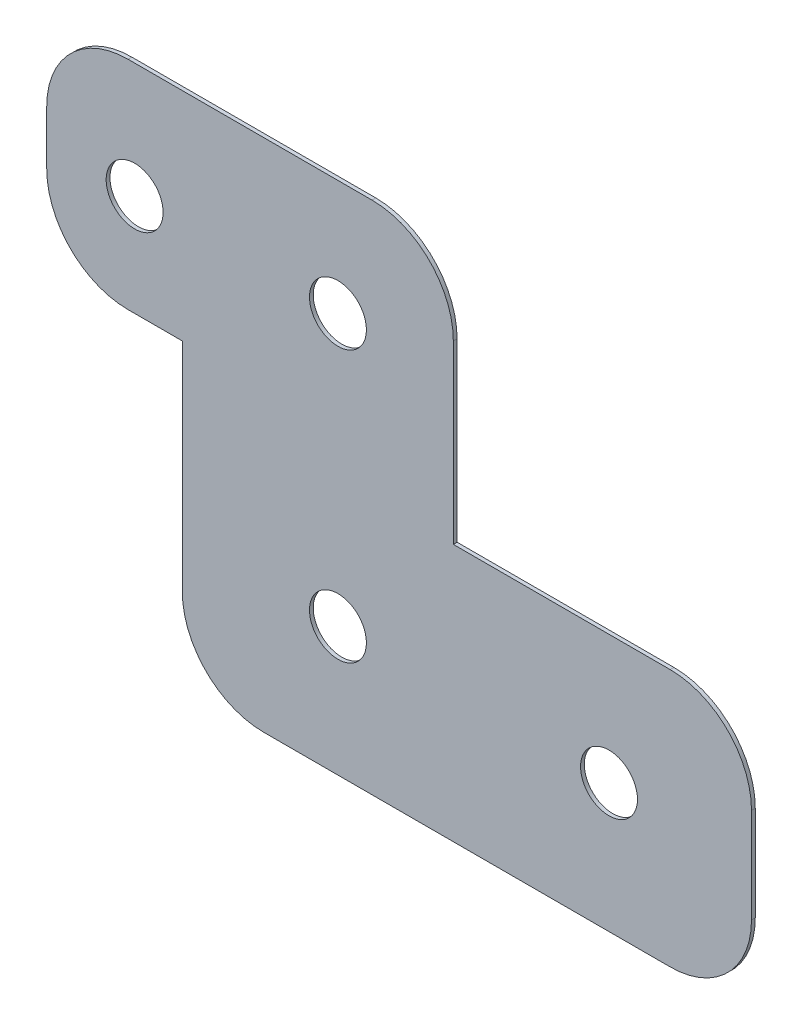
ISO-10303-21;
HEADER;
FILE_DESCRIPTION(('STEP AP214'),'2;1');
FILE_NAME('part.step','',(''),(''),'','','');
FILE_SCHEMA(('AUTOMOTIVE_DESIGN { 1 0 10303 214 1 1 1 1 }'));
ENDSEC;
DATA;
#1=APPLICATION_CONTEXT('core data for automotive mechanical design processes');
#2=APPLICATION_PROTOCOL_DEFINITION('international standard','automotive_design',2000,#1);
#3=PRODUCT_CONTEXT('',#1,'mechanical');
#4=PRODUCT('Part','Part','',(#3));
#5=PRODUCT_RELATED_PRODUCT_CATEGORY('part','',(#4));
#6=PRODUCT_DEFINITION_FORMATION('','',#4);
#7=PRODUCT_DEFINITION_CONTEXT('part definition',#1,'design');
#8=PRODUCT_DEFINITION('design','',#6,#7);
#9=PRODUCT_DEFINITION_SHAPE('','',#8);
#10=(LENGTH_UNIT() NAMED_UNIT(*) SI_UNIT(.MILLI.,.METRE.));
#11=(NAMED_UNIT(*) PLANE_ANGLE_UNIT() SI_UNIT($,.RADIAN.));
#12=(NAMED_UNIT(*) SI_UNIT($,.STERADIAN.) SOLID_ANGLE_UNIT());
#13=UNCERTAINTY_MEASURE_WITH_UNIT(LENGTH_MEASURE(1.E-05),#10,'distance_accuracy_value','');
#14=(GEOMETRIC_REPRESENTATION_CONTEXT(3) GLOBAL_UNCERTAINTY_ASSIGNED_CONTEXT((#13)) GLOBAL_UNIT_ASSIGNED_CONTEXT((#10,
#11,#12)) REPRESENTATION_CONTEXT('',''));
#15=CARTESIAN_POINT('',(0.,0.,0.));
#16=DIRECTION('',(0.,0.,1.));
#17=DIRECTION('',(1.,0.,0.));
#18=AXIS2_PLACEMENT_3D('',#15,#16,#17);
#19=CARTESIAN_POINT('',(-460.,380.,2.778125));
#20=DIRECTION('',(1.,0.,0.));
#21=DIRECTION('',(0.,0.,-1.));
#22=AXIS2_PLACEMENT_3D('',#19,#20,#21);
#23=PLANE('',#22);
#24=DIRECTION('',(0.,-1.,0.));
#25=VECTOR('',#24,1.);
#26=CARTESIAN_POINT('',(-460.,380.,0.));
#27=LINE('',#26,#25);
#28=CARTESIAN_POINT('',(-460.,320.,0.));
#29=VERTEX_POINT('',#28);
#30=CARTESIAN_POINT('',(-460.,280.,0.));
#31=VERTEX_POINT('',#30);
#32=EDGE_CURVE('E174',#29,#31,#27,.T.);
#33=ORIENTED_EDGE('',*,*,#32,.T.);
#34=DIRECTION('',(0.,0.,1.));
#35=VECTOR('',#34,1.);
#36=CARTESIAN_POINT('',(-460.,280.,2.778125));
#37=LINE('',#36,#35);
#38=CARTESIAN_POINT('',(-460.,280.,2.778125));
#39=VERTEX_POINT('',#38);
#40=EDGE_CURVE('E197',#31,#39,#37,.T.);
#41=ORIENTED_EDGE('',*,*,#40,.T.);
#42=DIRECTION('',(0.,-1.,0.));
#43=VECTOR('',#42,1.);
#44=CARTESIAN_POINT('',(-460.,380.,2.778125));
#45=LINE('',#44,#43);
#46=CARTESIAN_POINT('',(-460.,320.,2.778125));
#47=VERTEX_POINT('',#46);
#48=EDGE_CURVE('E175',#47,#39,#45,.T.);
#49=ORIENTED_EDGE('',*,*,#48,.F.);
#50=DIRECTION('',(0.,0.,-1.));
#51=VECTOR('',#50,1.);
#52=CARTESIAN_POINT('',(-460.,320.,2.778125));
#53=LINE('',#52,#51);
#54=EDGE_CURVE('E186',#47,#29,#53,.T.);
#55=ORIENTED_EDGE('',*,*,#54,.T.);
#56=EDGE_LOOP('',(#33,#41,#49,#55));
#57=FACE_BOUND('',#56,.T.);
#58=ADVANCED_FACE('F33',(#57),#23,.F.);
#59=CARTESIAN_POINT('',(-460.,0.,2.778125));
#60=DIRECTION('',(0.,1.,0.));
#61=DIRECTION('',(0.,0.,1.));
#62=AXIS2_PLACEMENT_3D('',#59,#60,#61);
#63=PLANE('',#62);
#64=DIRECTION('',(1.,0.,0.));
#65=VECTOR('',#64,1.);
#66=CARTESIAN_POINT('',(-460.,0.,0.));
#67=LINE('',#66,#65);
#68=CARTESIAN_POINT('',(-300.,0.,0.));
#69=VERTEX_POINT('',#68);
#70=CARTESIAN_POINT('',(0.,0.,0.));
#71=VERTEX_POINT('',#70);
#72=EDGE_CURVE('E189',#69,#71,#67,.T.);
#73=ORIENTED_EDGE('',*,*,#72,.T.);
#74=DIRECTION('',(0.,0.,-1.));
#75=VECTOR('',#74,1.);
#76=CARTESIAN_POINT('',(0.,0.,2.778125));
#77=LINE('',#76,#75);
#78=CARTESIAN_POINT('',(0.,0.,2.778125));
#79=VERTEX_POINT('',#78);
#80=EDGE_CURVE('E41',#71,#79,#77,.F.);
#81=ORIENTED_EDGE('',*,*,#80,.T.);
#82=DIRECTION('',(1.,0.,0.));
#83=VECTOR('',#82,1.);
#84=CARTESIAN_POINT('',(-460.,0.,2.778125));
#85=LINE('',#84,#83);
#86=CARTESIAN_POINT('',(-300.,0.,2.778125));
#87=VERTEX_POINT('',#86);
#88=EDGE_CURVE('E177',#87,#79,#85,.T.);
#89=ORIENTED_EDGE('',*,*,#88,.F.);
#90=DIRECTION('',(0.,0.,1.));
#91=VECTOR('',#90,1.);
#92=CARTESIAN_POINT('',(-300.,0.,2.778125));
#93=LINE('',#92,#91);
#94=EDGE_CURVE('E240',#87,#69,#93,.F.);
#95=ORIENTED_EDGE('',*,*,#94,.T.);
#96=EDGE_LOOP('',(#73,#81,#89,#95));
#97=FACE_BOUND('',#96,.T.);
#98=ADVANCED_FACE('F244',(#97),#63,.F.);
#99=CARTESIAN_POINT('',(60.,380.,2.778125));
#100=DIRECTION('',(-1.,0.,0.));
#101=DIRECTION('',(0.,0.,1.));
#102=AXIS2_PLACEMENT_3D('',#99,#100,#101);
#103=PLANE('',#102);
#104=DIRECTION('',(0.,1.,0.));
#105=VECTOR('',#104,1.);
#106=CARTESIAN_POINT('',(60.,380.,0.));
#107=LINE('',#106,#105);
#108=CARTESIAN_POINT('',(60.,60.,0.));
#109=VERTEX_POINT('',#108);
#110=CARTESIAN_POINT('',(60.,130.,0.));
#111=VERTEX_POINT('',#110);
#112=EDGE_CURVE('E191',#109,#111,#107,.T.);
#113=ORIENTED_EDGE('',*,*,#112,.T.);
#114=DIRECTION('',(0.,0.,1.));
#115=VECTOR('',#114,1.);
#116=CARTESIAN_POINT('',(60.,130.,2.778125));
#117=LINE('',#116,#115);
#118=CARTESIAN_POINT('',(60.,130.,2.778125));
#119=VERTEX_POINT('',#118);
#120=EDGE_CURVE('E235',#111,#119,#117,.T.);
#121=ORIENTED_EDGE('',*,*,#120,.T.);
#122=DIRECTION('',(0.,1.,0.));
#123=VECTOR('',#122,1.);
#124=CARTESIAN_POINT('',(60.,380.,2.778125));
#125=LINE('',#124,#123);
#126=CARTESIAN_POINT('',(60.,60.,2.778125));
#127=VERTEX_POINT('',#126);
#128=EDGE_CURVE('E181',#127,#119,#125,.T.);
#129=ORIENTED_EDGE('',*,*,#128,.F.);
#130=DIRECTION('',(0.,0.,-1.));
#131=VECTOR('',#130,1.);
#132=CARTESIAN_POINT('',(60.,60.,2.778125));
#133=LINE('',#132,#131);
#134=EDGE_CURVE('E232',#127,#109,#133,.T.);
#135=ORIENTED_EDGE('',*,*,#134,.T.);
#136=EDGE_LOOP('',(#113,#121,#129,#135));
#137=FACE_BOUND('',#136,.T.);
#138=ADVANCED_FACE('F252',(#137),#103,.F.);
#139=CARTESIAN_POINT('',(-460.,380.,2.778125));
#140=DIRECTION('',(0.,-1.,0.));
#141=DIRECTION('',(0.,0.,-1.));
#142=AXIS2_PLACEMENT_3D('',#139,#140,#141);
#143=PLANE('',#142);
#144=DIRECTION('',(-1.,0.,0.));
#145=VECTOR('',#144,1.);
#146=CARTESIAN_POINT('',(-460.,380.,2.778125));
#147=LINE('',#146,#145);
#148=CARTESIAN_POINT('',(-220.,380.,2.778125));
#149=VERTEX_POINT('',#148);
#150=CARTESIAN_POINT('',(-400.,380.,2.778125));
#151=VERTEX_POINT('',#150);
#152=EDGE_CURVE('E184',#149,#151,#147,.T.);
#153=ORIENTED_EDGE('',*,*,#152,.F.);
#154=DIRECTION('',(0.,0.,1.));
#155=VECTOR('',#154,1.);
#156=CARTESIAN_POINT('',(-220.,380.,2.778125));
#157=LINE('',#156,#155);
#158=CARTESIAN_POINT('',(-220.,380.,0.));
#159=VERTEX_POINT('',#158);
#160=EDGE_CURVE('E224',#149,#159,#157,.F.);
#161=ORIENTED_EDGE('',*,*,#160,.T.);
#162=DIRECTION('',(-1.,0.,0.));
#163=VECTOR('',#162,1.);
#164=CARTESIAN_POINT('',(-460.,380.,0.));
#165=LINE('',#164,#163);
#166=CARTESIAN_POINT('',(-400.,380.,0.));
#167=VERTEX_POINT('',#166);
#168=EDGE_CURVE('E178',#159,#167,#165,.T.);
#169=ORIENTED_EDGE('',*,*,#168,.T.);
#170=DIRECTION('',(0.,0.,-1.));
#171=VECTOR('',#170,1.);
#172=CARTESIAN_POINT('',(-400.,380.,2.778125));
#173=LINE('',#172,#171);
#174=EDGE_CURVE('E210',#167,#151,#173,.F.);
#175=ORIENTED_EDGE('',*,*,#174,.T.);
#176=EDGE_LOOP('',(#153,#161,#169,#175));
#177=FACE_BOUND('',#176,.T.);
#178=ADVANCED_FACE('F273',(#177),#143,.F.);
#179=CARTESIAN_POINT('',(0.,0.,2.778125));
#180=DIRECTION('',(0.,0.,1.));
#181=DIRECTION('',(1.,0.,0.));
#182=AXIS2_PLACEMENT_3D('',#179,#180,#181);
#183=PLANE('',#182);
#184=CARTESIAN_POINT('',(-395.138918322417,295.,2.778125));
#185=DIRECTION('',(0.,0.,1.));
#186=DIRECTION('',(1.,0.,0.));
#187=AXIS2_PLACEMENT_3D('',#184,#185,#186);
#188=CIRCLE('',#187,21.);
#189=CARTESIAN_POINT('',(-374.138918322417,295.,2.778125));
#190=VERTEX_POINT('',#189);
#191=EDGE_CURVE('E307',#190,#190,#188,.T.);
#192=ORIENTED_EDGE('',*,*,#191,.F.);
#193=EDGE_LOOP('',(#192));
#194=FACE_BOUND('',#193,.T.);
#195=CARTESIAN_POINT('',(-245.138918322417,295.,2.778125));
#196=DIRECTION('',(0.,0.,1.));
#197=DIRECTION('',(1.,0.,0.));
#198=AXIS2_PLACEMENT_3D('',#195,#196,#197);
#199=CIRCLE('',#198,21.);
#200=CARTESIAN_POINT('',(-224.138918322417,295.,2.778125));
#201=VERTEX_POINT('',#200);
#202=EDGE_CURVE('E301',#201,#201,#199,.T.);
#203=ORIENTED_EDGE('',*,*,#202,.F.);
#204=EDGE_LOOP('',(#203));
#205=FACE_BOUND('',#204,.T.);
#206=CARTESIAN_POINT('',(-245.138918322417,95.,2.778125));
#207=DIRECTION('',(0.,0.,1.));
#208=DIRECTION('',(1.,0.,0.));
#209=AXIS2_PLACEMENT_3D('',#206,#207,#208);
#210=CIRCLE('',#209,21.);
#211=CARTESIAN_POINT('',(-224.138918322417,95.,2.778125));
#212=VERTEX_POINT('',#211);
#213=EDGE_CURVE('E295',#212,#212,#210,.T.);
#214=ORIENTED_EDGE('',*,*,#213,.F.);
#215=EDGE_LOOP('',(#214));
#216=FACE_BOUND('',#215,.T.);
#217=CARTESIAN_POINT('',(-45.1389183224165,95.,2.778125));
#218=DIRECTION('',(0.,0.,1.));
#219=DIRECTION('',(1.,0.,0.));
#220=AXIS2_PLACEMENT_3D('',#217,#218,#219);
#221=CIRCLE('',#220,21.);
#222=CARTESIAN_POINT('',(-24.1389183224165,95.,2.778125));
#223=VERTEX_POINT('',#222);
#224=EDGE_CURVE('E289',#223,#223,#221,.T.);
#225=ORIENTED_EDGE('',*,*,#224,.F.);
#226=EDGE_LOOP('',(#225));
#227=FACE_BOUND('',#226,.T.);
#228=DIRECTION('',(0.,-1.,0.));
#229=VECTOR('',#228,1.);
#230=CARTESIAN_POINT('',(-160.,380.,2.778125));
#231=LINE('',#230,#229);
#232=CARTESIAN_POINT('',(-160.,320.,2.778125));
#233=VERTEX_POINT('',#232);
#234=CARTESIAN_POINT('',(-160.,190.,2.778125));
#235=VERTEX_POINT('',#234);
#236=EDGE_CURVE('E151',#233,#235,#231,.T.);
#237=ORIENTED_EDGE('',*,*,#236,.F.);
#238=CARTESIAN_POINT('',(-220.,320.,2.778125));
#239=DIRECTION('',(0.,0.,1.));
#240=DIRECTION('',(1.,0.,0.));
#241=AXIS2_PLACEMENT_3D('',#238,#239,#240);
#242=CIRCLE('',#241,60.);
#243=EDGE_CURVE('E222',#233,#149,#242,.T.);
#244=ORIENTED_EDGE('',*,*,#243,.T.);
#245=ORIENTED_EDGE('',*,*,#152,.T.);
#246=CARTESIAN_POINT('',(-400.,320.,2.778125));
#247=DIRECTION('',(0.,0.,1.));
#248=DIRECTION('',(1.,0.,0.));
#249=AXIS2_PLACEMENT_3D('',#246,#247,#248);
#250=CIRCLE('',#249,60.);
#251=EDGE_CURVE('E200',#151,#47,#250,.T.);
#252=ORIENTED_EDGE('',*,*,#251,.T.);
#253=ORIENTED_EDGE('',*,*,#48,.T.);
#254=CARTESIAN_POINT('',(-400.,280.,2.778125));
#255=DIRECTION('',(0.,0.,1.));
#256=DIRECTION('',(1.,0.,0.));
#257=AXIS2_PLACEMENT_3D('',#254,#255,#256);
#258=CIRCLE('',#257,60.);
#259=CARTESIAN_POINT('',(-400.,220.,2.778125));
#260=VERTEX_POINT('',#259);
#261=EDGE_CURVE('E156',#39,#260,#258,.T.);
#262=ORIENTED_EDGE('',*,*,#261,.T.);
#263=DIRECTION('',(-1.,0.,0.));
#264=VECTOR('',#263,1.);
#265=CARTESIAN_POINT('',(-460.,220.,2.778125));
#266=LINE('',#265,#264);
#267=CARTESIAN_POINT('',(-360.,220.,2.778125));
#268=VERTEX_POINT('',#267);
#269=EDGE_CURVE('E141',#268,#260,#266,.T.);
#270=ORIENTED_EDGE('',*,*,#269,.F.);
#271=DIRECTION('',(0.,1.,0.));
#272=VECTOR('',#271,1.);
#273=CARTESIAN_POINT('',(-360.,0.,2.778125));
#274=LINE('',#273,#272);
#275=CARTESIAN_POINT('',(-360.,60.,2.778125));
#276=VERTEX_POINT('',#275);
#277=EDGE_CURVE('E134',#276,#268,#274,.T.);
#278=ORIENTED_EDGE('',*,*,#277,.F.);
#279=CARTESIAN_POINT('',(-300.,60.,2.778125));
#280=DIRECTION('',(0.,0.,1.));
#281=DIRECTION('',(1.,0.,0.));
#282=AXIS2_PLACEMENT_3D('',#279,#280,#281);
#283=CIRCLE('',#282,60.);
#284=EDGE_CURVE('E216',#276,#87,#283,.T.);
#285=ORIENTED_EDGE('',*,*,#284,.T.);
#286=ORIENTED_EDGE('',*,*,#88,.T.);
#287=CARTESIAN_POINT('',(0.,60.,2.778125));
#288=DIRECTION('',(0.,0.,1.));
#289=DIRECTION('',(1.,0.,0.));
#290=AXIS2_PLACEMENT_3D('',#287,#288,#289);
#291=CIRCLE('',#290,60.);
#292=EDGE_CURVE('E218',#79,#127,#291,.T.);
#293=ORIENTED_EDGE('',*,*,#292,.T.);
#294=ORIENTED_EDGE('',*,*,#128,.T.);
#295=CARTESIAN_POINT('',(0.,130.,2.778125));
#296=DIRECTION('',(0.,0.,1.));
#297=DIRECTION('',(1.,0.,0.));
#298=AXIS2_PLACEMENT_3D('',#295,#296,#297);
#299=CIRCLE('',#298,60.);
#300=CARTESIAN_POINT('',(0.,190.,2.778125));
#301=VERTEX_POINT('',#300);
#302=EDGE_CURVE('E220',#119,#301,#299,.T.);
#303=ORIENTED_EDGE('',*,*,#302,.T.);
#304=DIRECTION('',(1.,0.,0.));
#305=VECTOR('',#304,1.);
#306=CARTESIAN_POINT('',(60.,190.,2.778125));
#307=LINE('',#306,#305);
#308=EDGE_CURVE('E165',#235,#301,#307,.T.);
#309=ORIENTED_EDGE('',*,*,#308,.F.);
#310=EDGE_LOOP('',(#237,#244,#245,#252,#253,#262,#270,#278,#285,#286,#293,#294,#303,#309));
#311=FACE_BOUND('',#310,.T.);
#312=ADVANCED_FACE('F154',(#194,#205,#216,#227,#311),#183,.T.);
#313=CARTESIAN_POINT('',(0.,0.,0.));
#314=DIRECTION('',(0.,0.,1.));
#315=DIRECTION('',(1.,0.,0.));
#316=AXIS2_PLACEMENT_3D('',#313,#314,#315);
#317=PLANE('',#316);
#318=CARTESIAN_POINT('',(-395.138918322417,295.,0.));
#319=DIRECTION('',(0.,0.,1.));
#320=DIRECTION('',(1.,0.,0.));
#321=AXIS2_PLACEMENT_3D('',#318,#319,#320);
#322=CIRCLE('',#321,21.);
#323=CARTESIAN_POINT('',(-374.138918322417,295.,0.));
#324=VERTEX_POINT('',#323);
#325=EDGE_CURVE('E142',#324,#324,#322,.T.);
#326=ORIENTED_EDGE('',*,*,#325,.T.);
#327=EDGE_LOOP('',(#326));
#328=FACE_BOUND('',#327,.T.);
#329=CARTESIAN_POINT('',(-245.138918322417,295.,0.));
#330=DIRECTION('',(0.,0.,1.));
#331=DIRECTION('',(1.,0.,0.));
#332=AXIS2_PLACEMENT_3D('',#329,#330,#331);
#333=CIRCLE('',#332,21.);
#334=CARTESIAN_POINT('',(-224.138918322417,295.,0.));
#335=VERTEX_POINT('',#334);
#336=EDGE_CURVE('E304',#335,#335,#333,.T.);
#337=ORIENTED_EDGE('',*,*,#336,.T.);
#338=EDGE_LOOP('',(#337));
#339=FACE_BOUND('',#338,.T.);
#340=CARTESIAN_POINT('',(-245.138918322417,95.,0.));
#341=DIRECTION('',(0.,0.,1.));
#342=DIRECTION('',(1.,0.,0.));
#343=AXIS2_PLACEMENT_3D('',#340,#341,#342);
#344=CIRCLE('',#343,21.);
#345=CARTESIAN_POINT('',(-224.138918322417,95.,0.));
#346=VERTEX_POINT('',#345);
#347=EDGE_CURVE('E298',#346,#346,#344,.T.);
#348=ORIENTED_EDGE('',*,*,#347,.T.);
#349=EDGE_LOOP('',(#348));
#350=FACE_BOUND('',#349,.T.);
#351=CARTESIAN_POINT('',(-45.1389183224165,95.,0.));
#352=DIRECTION('',(0.,0.,1.));
#353=DIRECTION('',(1.,0.,0.));
#354=AXIS2_PLACEMENT_3D('',#351,#352,#353);
#355=CIRCLE('',#354,21.);
#356=CARTESIAN_POINT('',(-24.1389183224165,95.,0.));
#357=VERTEX_POINT('',#356);
#358=EDGE_CURVE('E292',#357,#357,#355,.T.);
#359=ORIENTED_EDGE('',*,*,#358,.T.);
#360=EDGE_LOOP('',(#359));
#361=FACE_BOUND('',#360,.T.);
#362=ORIENTED_EDGE('',*,*,#168,.F.);
#363=CARTESIAN_POINT('',(-220.,320.,0.));
#364=DIRECTION('',(0.,0.,1.));
#365=DIRECTION('',(1.,0.,0.));
#366=AXIS2_PLACEMENT_3D('',#363,#364,#365);
#367=CIRCLE('',#366,60.);
#368=CARTESIAN_POINT('',(-160.,320.,0.));
#369=VERTEX_POINT('',#368);
#370=EDGE_CURVE('E230',#159,#369,#367,.F.);
#371=ORIENTED_EDGE('',*,*,#370,.T.);
#372=DIRECTION('',(0.,-1.,0.));
#373=VECTOR('',#372,1.);
#374=CARTESIAN_POINT('',(-160.,380.,0.));
#375=LINE('',#374,#373);
#376=CARTESIAN_POINT('',(-160.,190.,0.));
#377=VERTEX_POINT('',#376);
#378=EDGE_CURVE('E162',#369,#377,#375,.T.);
#379=ORIENTED_EDGE('',*,*,#378,.T.);
#380=DIRECTION('',(1.,0.,0.));
#381=VECTOR('',#380,1.);
#382=CARTESIAN_POINT('',(60.,190.,0.));
#383=LINE('',#382,#381);
#384=CARTESIAN_POINT('',(0.,190.,0.));
#385=VERTEX_POINT('',#384);
#386=EDGE_CURVE('E164',#377,#385,#383,.T.);
#387=ORIENTED_EDGE('',*,*,#386,.T.);
#388=CARTESIAN_POINT('',(0.,130.,0.));
#389=DIRECTION('',(0.,0.,1.));
#390=DIRECTION('',(1.,0.,0.));
#391=AXIS2_PLACEMENT_3D('',#388,#389,#390);
#392=CIRCLE('',#391,60.);
#393=EDGE_CURVE('E228',#385,#111,#392,.F.);
#394=ORIENTED_EDGE('',*,*,#393,.T.);
#395=ORIENTED_EDGE('',*,*,#112,.F.);
#396=CARTESIAN_POINT('',(0.,60.,0.));
#397=DIRECTION('',(0.,0.,1.));
#398=DIRECTION('',(1.,0.,0.));
#399=AXIS2_PLACEMENT_3D('',#396,#397,#398);
#400=CIRCLE('',#399,60.);
#401=EDGE_CURVE('E54',#109,#71,#400,.F.);
#402=ORIENTED_EDGE('',*,*,#401,.T.);
#403=ORIENTED_EDGE('',*,*,#72,.F.);
#404=CARTESIAN_POINT('',(-300.,60.,0.));
#405=DIRECTION('',(0.,0.,1.));
#406=DIRECTION('',(1.,0.,0.));
#407=AXIS2_PLACEMENT_3D('',#404,#405,#406);
#408=CIRCLE('',#407,60.);
#409=CARTESIAN_POINT('',(-360.,60.,0.));
#410=VERTEX_POINT('',#409);
#411=EDGE_CURVE('E48',#69,#410,#408,.F.);
#412=ORIENTED_EDGE('',*,*,#411,.T.);
#413=DIRECTION('',(0.,1.,0.));
#414=VECTOR('',#413,1.);
#415=CARTESIAN_POINT('',(-360.,0.,0.));
#416=LINE('',#415,#414);
#417=CARTESIAN_POINT('',(-360.,220.,0.));
#418=VERTEX_POINT('',#417);
#419=EDGE_CURVE('E157',#410,#418,#416,.T.);
#420=ORIENTED_EDGE('',*,*,#419,.T.);
#421=DIRECTION('',(-1.,0.,0.));
#422=VECTOR('',#421,1.);
#423=CARTESIAN_POINT('',(-460.,220.,0.));
#424=LINE('',#423,#422);
#425=CARTESIAN_POINT('',(-400.,220.,0.));
#426=VERTEX_POINT('',#425);
#427=EDGE_CURVE('E150',#418,#426,#424,.T.);
#428=ORIENTED_EDGE('',*,*,#427,.T.);
#429=CARTESIAN_POINT('',(-400.,280.,0.));
#430=DIRECTION('',(0.,0.,1.));
#431=DIRECTION('',(1.,0.,0.));
#432=AXIS2_PLACEMENT_3D('',#429,#430,#431);
#433=CIRCLE('',#432,60.);
#434=EDGE_CURVE('E208',#426,#31,#433,.F.);
#435=ORIENTED_EDGE('',*,*,#434,.T.);
#436=ORIENTED_EDGE('',*,*,#32,.F.);
#437=CARTESIAN_POINT('',(-400.,320.,0.));
#438=DIRECTION('',(0.,0.,1.));
#439=DIRECTION('',(1.,0.,0.));
#440=AXIS2_PLACEMENT_3D('',#437,#438,#439);
#441=CIRCLE('',#440,60.);
#442=EDGE_CURVE('E205',#29,#167,#441,.F.);
#443=ORIENTED_EDGE('',*,*,#442,.T.);
#444=EDGE_LOOP('',(#362,#371,#379,#387,#394,#395,#402,#403,#412,#420,#428,#435,#436,#443));
#445=FACE_BOUND('',#444,.T.);
#446=ADVANCED_FACE('F255',(#328,#339,#350,#361,#445),#317,.F.);
#447=CARTESIAN_POINT('',(60.,190.,0.));
#448=DIRECTION('',(0.,-1.,0.));
#449=DIRECTION('',(1.,0.,0.));
#450=AXIS2_PLACEMENT_3D('',#447,#448,#449);
#451=PLANE('',#450);
#452=ORIENTED_EDGE('',*,*,#308,.T.);
#453=DIRECTION('',(0.,0.,1.));
#454=VECTOR('',#453,1.);
#455=CARTESIAN_POINT('',(0.,190.,0.));
#456=LINE('',#455,#454);
#457=EDGE_CURVE('E238',#301,#385,#456,.F.);
#458=ORIENTED_EDGE('',*,*,#457,.T.);
#459=ORIENTED_EDGE('',*,*,#386,.F.);
#460=DIRECTION('',(0.,0.,1.));
#461=VECTOR('',#460,1.);
#462=CARTESIAN_POINT('',(-160.,190.,0.));
#463=LINE('',#462,#461);
#464=EDGE_CURVE('E168',#377,#235,#463,.T.);
#465=ORIENTED_EDGE('',*,*,#464,.T.);
#466=EDGE_LOOP('',(#452,#458,#459,#465));
#467=FACE_BOUND('',#466,.T.);
#468=ADVANCED_FACE('F263',(#467),#451,.F.);
#469=CARTESIAN_POINT('',(-160.,380.,0.));
#470=DIRECTION('',(-1.,0.,0.));
#471=DIRECTION('',(0.,-1.,0.));
#472=AXIS2_PLACEMENT_3D('',#469,#470,#471);
#473=PLANE('',#472);
#474=ORIENTED_EDGE('',*,*,#378,.F.);
#475=DIRECTION('',(0.,0.,1.));
#476=VECTOR('',#475,1.);
#477=CARTESIAN_POINT('',(-160.,320.,0.));
#478=LINE('',#477,#476);
#479=EDGE_CURVE('E213',#369,#233,#478,.T.);
#480=ORIENTED_EDGE('',*,*,#479,.T.);
#481=ORIENTED_EDGE('',*,*,#236,.T.);
#482=ORIENTED_EDGE('',*,*,#464,.F.);
#483=EDGE_LOOP('',(#474,#480,#481,#482));
#484=FACE_BOUND('',#483,.T.);
#485=ADVANCED_FACE('F267',(#484),#473,.F.);
#486=CARTESIAN_POINT('',(-460.,220.,0.));
#487=DIRECTION('',(0.,1.,0.));
#488=DIRECTION('',(0.,0.,1.));
#489=AXIS2_PLACEMENT_3D('',#486,#487,#488);
#490=PLANE('',#489);
#491=ORIENTED_EDGE('',*,*,#269,.T.);
#492=DIRECTION('',(0.,0.,1.));
#493=VECTOR('',#492,1.);
#494=CARTESIAN_POINT('',(-400.,220.,0.));
#495=LINE('',#494,#493);
#496=EDGE_CURVE('E203',#260,#426,#495,.F.);
#497=ORIENTED_EDGE('',*,*,#496,.T.);
#498=ORIENTED_EDGE('',*,*,#427,.F.);
#499=DIRECTION('',(0.,0.,1.));
#500=VECTOR('',#499,1.);
#501=CARTESIAN_POINT('',(-360.,220.,0.));
#502=LINE('',#501,#500);
#503=EDGE_CURVE('E137',#418,#268,#502,.T.);
#504=ORIENTED_EDGE('',*,*,#503,.T.);
#505=EDGE_LOOP('',(#491,#497,#498,#504));
#506=FACE_BOUND('',#505,.T.);
#507=ADVANCED_FACE('F147',(#506),#490,.F.);
#508=CARTESIAN_POINT('',(-360.,0.,0.));
#509=DIRECTION('',(1.,0.,0.));
#510=DIRECTION('',(0.,0.,-1.));
#511=AXIS2_PLACEMENT_3D('',#508,#509,#510);
#512=PLANE('',#511);
#513=ORIENTED_EDGE('',*,*,#419,.F.);
#514=DIRECTION('',(0.,0.,1.));
#515=VECTOR('',#514,1.);
#516=CARTESIAN_POINT('',(-360.,60.,0.));
#517=LINE('',#516,#515);
#518=EDGE_CURVE('E11',#410,#276,#517,.T.);
#519=ORIENTED_EDGE('',*,*,#518,.T.);
#520=ORIENTED_EDGE('',*,*,#277,.T.);
#521=ORIENTED_EDGE('',*,*,#503,.F.);
#522=EDGE_LOOP('',(#513,#519,#520,#521));
#523=FACE_BOUND('',#522,.T.);
#524=ADVANCED_FACE('F136',(#523),#512,.F.);
#525=CARTESIAN_POINT('',(-400.,280.,2.778125));
#526=DIRECTION('',(0.,0.,1.));
#527=DIRECTION('',(1.,0.,0.));
#528=AXIS2_PLACEMENT_3D('',#525,#526,#527);
#529=CYLINDRICAL_SURFACE('',#528,60.);
#530=ORIENTED_EDGE('',*,*,#434,.F.);
#531=ORIENTED_EDGE('',*,*,#496,.F.);
#532=ORIENTED_EDGE('',*,*,#261,.F.);
#533=ORIENTED_EDGE('',*,*,#40,.F.);
#534=EDGE_LOOP('',(#530,#531,#532,#533));
#535=FACE_BOUND('',#534,.T.);
#536=ADVANCED_FACE('F287',(#535),#529,.T.);
#537=CARTESIAN_POINT('',(-400.,320.,2.778125));
#538=DIRECTION('',(0.,0.,-1.));
#539=DIRECTION('',(-1.,0.,0.));
#540=AXIS2_PLACEMENT_3D('',#537,#538,#539);
#541=CYLINDRICAL_SURFACE('',#540,60.);
#542=ORIENTED_EDGE('',*,*,#251,.F.);
#543=ORIENTED_EDGE('',*,*,#174,.F.);
#544=ORIENTED_EDGE('',*,*,#442,.F.);
#545=ORIENTED_EDGE('',*,*,#54,.F.);
#546=EDGE_LOOP('',(#542,#543,#544,#545));
#547=FACE_BOUND('',#546,.T.);
#548=ADVANCED_FACE('F281',(#547),#541,.T.);
#549=CARTESIAN_POINT('',(-220.,320.,0.));
#550=DIRECTION('',(0.,0.,1.));
#551=DIRECTION('',(1.,0.,0.));
#552=AXIS2_PLACEMENT_3D('',#549,#550,#551);
#553=CYLINDRICAL_SURFACE('',#552,60.);
#554=ORIENTED_EDGE('',*,*,#370,.F.);
#555=ORIENTED_EDGE('',*,*,#160,.F.);
#556=ORIENTED_EDGE('',*,*,#243,.F.);
#557=ORIENTED_EDGE('',*,*,#479,.F.);
#558=EDGE_LOOP('',(#554,#555,#556,#557));
#559=FACE_BOUND('',#558,.T.);
#560=ADVANCED_FACE('F277',(#559),#553,.T.);
#561=CARTESIAN_POINT('',(0.,130.,2.778125));
#562=DIRECTION('',(0.,0.,1.));
#563=DIRECTION('',(1.,0.,0.));
#564=AXIS2_PLACEMENT_3D('',#561,#562,#563);
#565=CYLINDRICAL_SURFACE('',#564,60.);
#566=ORIENTED_EDGE('',*,*,#393,.F.);
#567=ORIENTED_EDGE('',*,*,#457,.F.);
#568=ORIENTED_EDGE('',*,*,#302,.F.);
#569=ORIENTED_EDGE('',*,*,#120,.F.);
#570=EDGE_LOOP('',(#566,#567,#568,#569));
#571=FACE_BOUND('',#570,.T.);
#572=ADVANCED_FACE('F260',(#571),#565,.T.);
#573=CARTESIAN_POINT('',(0.,60.,2.778125));
#574=DIRECTION('',(0.,0.,-1.));
#575=DIRECTION('',(-1.,0.,0.));
#576=AXIS2_PLACEMENT_3D('',#573,#574,#575);
#577=CYLINDRICAL_SURFACE('',#576,60.);
#578=ORIENTED_EDGE('',*,*,#292,.F.);
#579=ORIENTED_EDGE('',*,*,#80,.F.);
#580=ORIENTED_EDGE('',*,*,#401,.F.);
#581=ORIENTED_EDGE('',*,*,#134,.F.);
#582=EDGE_LOOP('',(#578,#579,#580,#581));
#583=FACE_BOUND('',#582,.T.);
#584=ADVANCED_FACE('F250',(#583),#577,.T.);
#585=CARTESIAN_POINT('',(-300.,60.,0.));
#586=DIRECTION('',(0.,0.,1.));
#587=DIRECTION('',(1.,0.,0.));
#588=AXIS2_PLACEMENT_3D('',#585,#586,#587);
#589=CYLINDRICAL_SURFACE('',#588,60.);
#590=ORIENTED_EDGE('',*,*,#411,.F.);
#591=ORIENTED_EDGE('',*,*,#94,.F.);
#592=ORIENTED_EDGE('',*,*,#284,.F.);
#593=ORIENTED_EDGE('',*,*,#518,.F.);
#594=EDGE_LOOP('',(#590,#591,#592,#593));
#595=FACE_BOUND('',#594,.T.);
#596=ADVANCED_FACE('F35',(#595),#589,.T.);
#597=CARTESIAN_POINT('',(-45.1389183224165,95.,0.));
#598=DIRECTION('',(0.,0.,1.));
#599=DIRECTION('',(1.,0.,0.));
#600=AXIS2_PLACEMENT_3D('',#597,#598,#599);
#601=CYLINDRICAL_SURFACE('',#600,21.);
#602=ORIENTED_EDGE('',*,*,#358,.F.);
#603=EDGE_LOOP('',(#602));
#604=FACE_BOUND('',#603,.T.);
#605=ORIENTED_EDGE('',*,*,#224,.T.);
#606=EDGE_LOOP('',(#605));
#607=FACE_BOUND('',#606,.T.);
#608=ADVANCED_FACE('F331',(#604,#607),#601,.F.);
#609=CARTESIAN_POINT('',(-245.138918322417,95.,0.));
#610=DIRECTION('',(0.,0.,1.));
#611=DIRECTION('',(1.,0.,0.));
#612=AXIS2_PLACEMENT_3D('',#609,#610,#611);
#613=CYLINDRICAL_SURFACE('',#612,21.);
#614=ORIENTED_EDGE('',*,*,#347,.F.);
#615=EDGE_LOOP('',(#614));
#616=FACE_BOUND('',#615,.T.);
#617=ORIENTED_EDGE('',*,*,#213,.T.);
#618=EDGE_LOOP('',(#617));
#619=FACE_BOUND('',#618,.T.);
#620=ADVANCED_FACE('F333',(#616,#619),#613,.F.);
#621=CARTESIAN_POINT('',(-245.138918322417,295.,0.));
#622=DIRECTION('',(0.,0.,1.));
#623=DIRECTION('',(1.,0.,0.));
#624=AXIS2_PLACEMENT_3D('',#621,#622,#623);
#625=CYLINDRICAL_SURFACE('',#624,21.);
#626=ORIENTED_EDGE('',*,*,#336,.F.);
#627=EDGE_LOOP('',(#626));
#628=FACE_BOUND('',#627,.T.);
#629=ORIENTED_EDGE('',*,*,#202,.T.);
#630=EDGE_LOOP('',(#629));
#631=FACE_BOUND('',#630,.T.);
#632=ADVANCED_FACE('F318',(#628,#631),#625,.F.);
#633=CARTESIAN_POINT('',(-395.138918322417,295.,0.));
#634=DIRECTION('',(0.,0.,1.));
#635=DIRECTION('',(1.,0.,0.));
#636=AXIS2_PLACEMENT_3D('',#633,#634,#635);
#637=CYLINDRICAL_SURFACE('',#636,21.);
#638=ORIENTED_EDGE('',*,*,#325,.F.);
#639=EDGE_LOOP('',(#638));
#640=FACE_BOUND('',#639,.T.);
#641=ORIENTED_EDGE('',*,*,#191,.T.);
#642=EDGE_LOOP('',(#641));
#643=FACE_BOUND('',#642,.T.);
#644=ADVANCED_FACE('F315',(#640,#643),#637,.F.);
#645=CLOSED_SHELL('',(#58,#98,#138,#178,#312,#446,#468,#485,#507,#524,#536,#548,#560,#572,#584,
#596,#608,#620,#632,#644));
#646=MANIFOLD_SOLID_BREP('B2',#645);
#647=ADVANCED_BREP_SHAPE_REPRESENTATION('',(#18,#646),#14);
#648=SHAPE_DEFINITION_REPRESENTATION(#9,#647);
ENDSEC;
END-ISO-10303-21;
